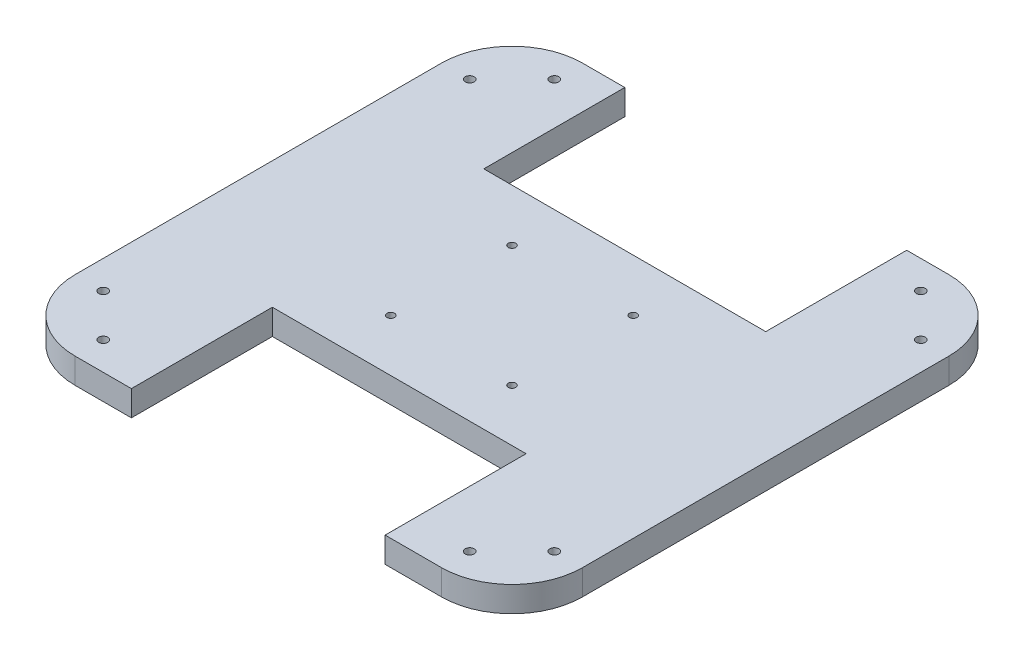
ISO-10303-21;
HEADER;
FILE_DESCRIPTION(('STEP AP214'),'2;1');
FILE_NAME('part.step','',(''),(''),'','','');
FILE_SCHEMA(('AUTOMOTIVE_DESIGN { 1 0 10303 214 1 1 1 1 }'));
ENDSEC;
DATA;
#1=APPLICATION_CONTEXT('core data for automotive mechanical design processes');
#2=APPLICATION_PROTOCOL_DEFINITION('international standard','automotive_design',2000,#1);
#3=PRODUCT_CONTEXT('',#1,'mechanical');
#4=PRODUCT('Part','Part','',(#3));
#5=PRODUCT_RELATED_PRODUCT_CATEGORY('part','',(#4));
#6=PRODUCT_DEFINITION_FORMATION('','',#4);
#7=PRODUCT_DEFINITION_CONTEXT('part definition',#1,'design');
#8=PRODUCT_DEFINITION('design','',#6,#7);
#9=PRODUCT_DEFINITION_SHAPE('','',#8);
#10=(LENGTH_UNIT() NAMED_UNIT(*) SI_UNIT(.MILLI.,.METRE.));
#11=(NAMED_UNIT(*) PLANE_ANGLE_UNIT() SI_UNIT($,.RADIAN.));
#12=(NAMED_UNIT(*) SI_UNIT($,.STERADIAN.) SOLID_ANGLE_UNIT());
#13=UNCERTAINTY_MEASURE_WITH_UNIT(LENGTH_MEASURE(1.E-05),#10,'distance_accuracy_value','');
#14=(GEOMETRIC_REPRESENTATION_CONTEXT(3) GLOBAL_UNCERTAINTY_ASSIGNED_CONTEXT((#13)) GLOBAL_UNIT_ASSIGNED_CONTEXT((#10,
#11,#12)) REPRESENTATION_CONTEXT('',''));
#15=CARTESIAN_POINT('',(0.,0.,0.));
#16=DIRECTION('',(0.,0.,1.));
#17=DIRECTION('',(1.,0.,0.));
#18=AXIS2_PLACEMENT_3D('',#15,#16,#17);
#19=CARTESIAN_POINT('',(-21.5,0.,-21.4999999999999));
#20=DIRECTION('',(0.,1.,0.));
#21=DIRECTION('',(0.,0.,1.));
#22=AXIS2_PLACEMENT_3D('',#19,#20,#21);
#23=CYLINDRICAL_SURFACE('',#22,1.325);
#24=CARTESIAN_POINT('',(-21.5,9.,-21.4999999999999));
#25=DIRECTION('',(0.,1.,0.));
#26=DIRECTION('',(0.,0.,1.));
#27=AXIS2_PLACEMENT_3D('',#24,#25,#26);
#28=CIRCLE('',#27,1.325);
#29=CARTESIAN_POINT('',(-21.5,9.,-20.1749999999999));
#30=VERTEX_POINT('',#29);
#31=EDGE_CURVE('E262',#30,#30,#28,.T.);
#32=ORIENTED_EDGE('',*,*,#31,.T.);
#33=EDGE_LOOP('',(#32));
#34=FACE_BOUND('',#33,.T.);
#35=CARTESIAN_POINT('',(-21.5,5.,-21.4999999999999));
#36=DIRECTION('',(0.,-1.,0.));
#37=DIRECTION('',(0.,0.,-1.));
#38=AXIS2_PLACEMENT_3D('',#35,#36,#37);
#39=CIRCLE('',#38,1.325);
#40=CARTESIAN_POINT('',(-21.5,5.,-22.8249999999999));
#41=VERTEX_POINT('',#40);
#42=EDGE_CURVE('E43',#41,#41,#39,.F.);
#43=ORIENTED_EDGE('',*,*,#42,.F.);
#44=EDGE_LOOP('',(#43));
#45=FACE_BOUND('',#44,.T.);
#46=ADVANCED_FACE('F39',(#34,#45),#23,.F.);
#47=CARTESIAN_POINT('',(21.5,0.,-21.4999999999999));
#48=DIRECTION('',(0.,1.,0.));
#49=DIRECTION('',(0.,0.,1.));
#50=AXIS2_PLACEMENT_3D('',#47,#48,#49);
#51=CYLINDRICAL_SURFACE('',#50,1.325);
#52=CARTESIAN_POINT('',(21.5,9.,-21.4999999999999));
#53=DIRECTION('',(0.,1.,0.));
#54=DIRECTION('',(0.,0.,1.));
#55=AXIS2_PLACEMENT_3D('',#52,#53,#54);
#56=CIRCLE('',#55,1.325);
#57=CARTESIAN_POINT('',(21.5,9.,-20.1749999999999));
#58=VERTEX_POINT('',#57);
#59=EDGE_CURVE('E259',#58,#58,#56,.T.);
#60=ORIENTED_EDGE('',*,*,#59,.T.);
#61=EDGE_LOOP('',(#60));
#62=FACE_BOUND('',#61,.T.);
#63=CARTESIAN_POINT('',(21.5,5.,-21.4999999999999));
#64=DIRECTION('',(0.,-1.,0.));
#65=DIRECTION('',(0.,0.,-1.));
#66=AXIS2_PLACEMENT_3D('',#63,#64,#65);
#67=CIRCLE('',#66,1.325);
#68=CARTESIAN_POINT('',(21.5,5.,-22.8249999999999));
#69=VERTEX_POINT('',#68);
#70=EDGE_CURVE('E225',#69,#69,#67,.F.);
#71=ORIENTED_EDGE('',*,*,#70,.F.);
#72=EDGE_LOOP('',(#71));
#73=FACE_BOUND('',#72,.T.);
#74=ADVANCED_FACE('F417',(#62,#73),#51,.F.);
#75=CARTESIAN_POINT('',(21.5,0.,21.5000000000001));
#76=DIRECTION('',(0.,1.,0.));
#77=DIRECTION('',(0.,0.,1.));
#78=AXIS2_PLACEMENT_3D('',#75,#76,#77);
#79=CYLINDRICAL_SURFACE('',#78,1.325);
#80=CARTESIAN_POINT('',(21.5,9.,21.5000000000001));
#81=DIRECTION('',(0.,1.,0.));
#82=DIRECTION('',(0.,0.,1.));
#83=AXIS2_PLACEMENT_3D('',#80,#81,#82);
#84=CIRCLE('',#83,1.325);
#85=CARTESIAN_POINT('',(21.5,9.,22.8250000000001));
#86=VERTEX_POINT('',#85);
#87=EDGE_CURVE('E263',#86,#86,#84,.T.);
#88=ORIENTED_EDGE('',*,*,#87,.T.);
#89=EDGE_LOOP('',(#88));
#90=FACE_BOUND('',#89,.T.);
#91=CARTESIAN_POINT('',(21.5,5.,21.5000000000001));
#92=DIRECTION('',(0.,-1.,0.));
#93=DIRECTION('',(0.,0.,-1.));
#94=AXIS2_PLACEMENT_3D('',#91,#92,#93);
#95=CIRCLE('',#94,1.325);
#96=CARTESIAN_POINT('',(21.5,5.,20.1750000000001));
#97=VERTEX_POINT('',#96);
#98=EDGE_CURVE('E222',#97,#97,#95,.F.);
#99=ORIENTED_EDGE('',*,*,#98,.F.);
#100=EDGE_LOOP('',(#99));
#101=FACE_BOUND('',#100,.T.);
#102=ADVANCED_FACE('F423',(#90,#101),#79,.F.);
#103=CARTESIAN_POINT('',(-21.5,0.,21.5000000000001));
#104=DIRECTION('',(0.,1.,0.));
#105=DIRECTION('',(0.,0.,1.));
#106=AXIS2_PLACEMENT_3D('',#103,#104,#105);
#107=CYLINDRICAL_SURFACE('',#106,1.325);
#108=CARTESIAN_POINT('',(-21.5,9.,21.5000000000001));
#109=DIRECTION('',(0.,1.,0.));
#110=DIRECTION('',(0.,0.,1.));
#111=AXIS2_PLACEMENT_3D('',#108,#109,#110);
#112=CIRCLE('',#111,1.325);
#113=CARTESIAN_POINT('',(-21.5,9.,22.8250000000001));
#114=VERTEX_POINT('',#113);
#115=EDGE_CURVE('E266',#114,#114,#112,.T.);
#116=ORIENTED_EDGE('',*,*,#115,.T.);
#117=EDGE_LOOP('',(#116));
#118=FACE_BOUND('',#117,.T.);
#119=CARTESIAN_POINT('',(-21.5,5.,21.5000000000001));
#120=DIRECTION('',(0.,-1.,0.));
#121=DIRECTION('',(0.,0.,-1.));
#122=AXIS2_PLACEMENT_3D('',#119,#120,#121);
#123=CIRCLE('',#122,1.325);
#124=CARTESIAN_POINT('',(-21.5,5.,20.1750000000001));
#125=VERTEX_POINT('',#124);
#126=EDGE_CURVE('E219',#125,#125,#123,.F.);
#127=ORIENTED_EDGE('',*,*,#126,.F.);
#128=EDGE_LOOP('',(#127));
#129=FACE_BOUND('',#128,.T.);
#130=ADVANCED_FACE('F429',(#118,#129),#107,.F.);
#131=CARTESIAN_POINT('',(-64.9999999999998,9.,-90.0000000000001));
#132=DIRECTION('',(0.,0.,1.));
#133=DIRECTION('',(1.,0.,0.));
#134=AXIS2_PLACEMENT_3D('',#131,#132,#133);
#135=PLANE('',#134);
#136=DIRECTION('',(-1.,0.,0.));
#137=VECTOR('',#136,1.);
#138=CARTESIAN_POINT('',(-64.9999999999998,0.,-90.0000000000001));
#139=LINE('',#138,#137);
#140=CARTESIAN_POINT('',(64.9999999999998,0.,-90.0000000000001));
#141=VERTEX_POINT('',#140);
#142=CARTESIAN_POINT('',(50.,0.,-90.0000000000001));
#143=VERTEX_POINT('',#142);
#144=EDGE_CURVE('E169',#141,#143,#139,.T.);
#145=ORIENTED_EDGE('',*,*,#144,.T.);
#146=DIRECTION('',(0.,1.,0.));
#147=VECTOR('',#146,1.);
#148=CARTESIAN_POINT('',(50.,0.,-90.0000000000001));
#149=LINE('',#148,#147);
#150=CARTESIAN_POINT('',(50.,9.,-90.0000000000001));
#151=VERTEX_POINT('',#150);
#152=EDGE_CURVE('E154',#143,#151,#149,.T.);
#153=ORIENTED_EDGE('',*,*,#152,.T.);
#154=DIRECTION('',(-1.,0.,0.));
#155=VECTOR('',#154,1.);
#156=CARTESIAN_POINT('',(-64.9999999999998,9.,-90.0000000000001));
#157=LINE('',#156,#155);
#158=CARTESIAN_POINT('',(64.9999999999998,9.,-90.0000000000001));
#159=VERTEX_POINT('',#158);
#160=EDGE_CURVE('E323',#159,#151,#157,.T.);
#161=ORIENTED_EDGE('',*,*,#160,.F.);
#162=DIRECTION('',(0.,-1.,0.));
#163=VECTOR('',#162,1.);
#164=CARTESIAN_POINT('',(64.9999999999998,9.,-90.0000000000001));
#165=LINE('',#164,#163);
#166=EDGE_CURVE('E11',#159,#141,#165,.T.);
#167=ORIENTED_EDGE('',*,*,#166,.T.);
#168=EDGE_LOOP('',(#145,#153,#161,#167));
#169=FACE_BOUND('',#168,.T.);
#170=ADVANCED_FACE('F174',(#169),#135,.F.);
#171=CARTESIAN_POINT('',(-64.9999999999998,9.,90.0000000000001));
#172=DIRECTION('',(0.,0.,-1.));
#173=DIRECTION('',(-1.,0.,0.));
#174=AXIS2_PLACEMENT_3D('',#171,#172,#173);
#175=PLANE('',#174);
#176=DIRECTION('',(1.,0.,0.));
#177=VECTOR('',#176,1.);
#178=CARTESIAN_POINT('',(-64.9999999999998,9.,90.0000000000001));
#179=LINE('',#178,#177);
#180=CARTESIAN_POINT('',(45.,9.,90.0000000000001));
#181=VERTEX_POINT('',#180);
#182=CARTESIAN_POINT('',(64.9999999999998,9.,90.0000000000001));
#183=VERTEX_POINT('',#182);
#184=EDGE_CURVE('E331',#181,#183,#179,.T.);
#185=ORIENTED_EDGE('',*,*,#184,.F.);
#186=DIRECTION('',(0.,1.,0.));
#187=VECTOR('',#186,1.);
#188=CARTESIAN_POINT('',(45.,0.,90.0000000000001));
#189=LINE('',#188,#187);
#190=CARTESIAN_POINT('',(45.,0.,90.0000000000001));
#191=VERTEX_POINT('',#190);
#192=EDGE_CURVE('E230',#191,#181,#189,.T.);
#193=ORIENTED_EDGE('',*,*,#192,.F.);
#194=DIRECTION('',(1.,0.,0.));
#195=VECTOR('',#194,1.);
#196=CARTESIAN_POINT('',(-64.9999999999998,0.,90.0000000000001));
#197=LINE('',#196,#195);
#198=CARTESIAN_POINT('',(64.9999999999998,0.,90.0000000000001));
#199=VERTEX_POINT('',#198);
#200=EDGE_CURVE('E189',#191,#199,#197,.T.);
#201=ORIENTED_EDGE('',*,*,#200,.T.);
#202=DIRECTION('',(0.,-1.,0.));
#203=VECTOR('',#202,1.);
#204=CARTESIAN_POINT('',(64.9999999999998,9.,90.0000000000001));
#205=LINE('',#204,#203);
#206=EDGE_CURVE('E205',#183,#199,#205,.T.);
#207=ORIENTED_EDGE('',*,*,#206,.F.);
#208=EDGE_LOOP('',(#185,#193,#201,#207));
#209=FACE_BOUND('',#208,.T.);
#210=ADVANCED_FACE('F354',(#209),#175,.F.);
#211=CARTESIAN_POINT('',(64.9999999999998,9.,-64.9999999999999));
#212=DIRECTION('',(0.,-1.,0.));
#213=DIRECTION('',(0.,0.,-1.));
#214=AXIS2_PLACEMENT_3D('',#211,#212,#213);
#215=CYLINDRICAL_SURFACE('',#214,25.0000000000002);
#216=CARTESIAN_POINT('',(64.9999999999998,0.,-64.9999999999999));
#217=DIRECTION('',(0.,1.,0.));
#218=DIRECTION('',(0.,0.,-1.));
#219=AXIS2_PLACEMENT_3D('',#216,#217,#218);
#220=CIRCLE('',#219,25.0000000000002);
#221=CARTESIAN_POINT('',(90.,0.,-64.9999999999999));
#222=VERTEX_POINT('',#221);
#223=EDGE_CURVE('E182',#222,#141,#220,.T.);
#224=ORIENTED_EDGE('',*,*,#223,.T.);
#225=ORIENTED_EDGE('',*,*,#166,.F.);
#226=CARTESIAN_POINT('',(64.9999999999998,9.,-64.9999999999999));
#227=DIRECTION('',(0.,1.,0.));
#228=DIRECTION('',(0.,0.,-1.));
#229=AXIS2_PLACEMENT_3D('',#226,#227,#228);
#230=CIRCLE('',#229,25.0000000000002);
#231=CARTESIAN_POINT('',(90.,9.,-64.9999999999999));
#232=VERTEX_POINT('',#231);
#233=EDGE_CURVE('E197',#232,#159,#230,.T.);
#234=ORIENTED_EDGE('',*,*,#233,.F.);
#235=DIRECTION('',(0.,-1.,0.));
#236=VECTOR('',#235,1.);
#237=CARTESIAN_POINT('',(90.,9.,-64.9999999999999));
#238=LINE('',#237,#236);
#239=EDGE_CURVE('E198',#232,#222,#238,.T.);
#240=ORIENTED_EDGE('',*,*,#239,.T.);
#241=EDGE_LOOP('',(#224,#225,#234,#240));
#242=FACE_BOUND('',#241,.T.);
#243=ADVANCED_FACE('F41',(#242),#215,.T.);
#244=CARTESIAN_POINT('',(-50.,9.,-90.0000000000001));
#245=VERTEX_POINT('',#244);
#246=CARTESIAN_POINT('',(-64.9999999999998,9.,-90.0000000000001));
#247=VERTEX_POINT('',#246);
#248=EDGE_CURVE('E322',#245,#247,#157,.T.);
#249=ORIENTED_EDGE('',*,*,#248,.F.);
#250=DIRECTION('',(0.,1.,0.));
#251=VECTOR('',#250,1.);
#252=CARTESIAN_POINT('',(-50.,0.,-90.0000000000001));
#253=LINE('',#252,#251);
#254=CARTESIAN_POINT('',(-50.,0.,-90.0000000000001));
#255=VERTEX_POINT('',#254);
#256=EDGE_CURVE('E163',#255,#245,#253,.T.);
#257=ORIENTED_EDGE('',*,*,#256,.F.);
#258=CARTESIAN_POINT('',(-64.9999999999998,0.,-90.0000000000001));
#259=VERTEX_POINT('',#258);
#260=EDGE_CURVE('E178',#255,#259,#139,.T.);
#261=ORIENTED_EDGE('',*,*,#260,.T.);
#262=DIRECTION('',(0.,-1.,0.));
#263=VECTOR('',#262,1.);
#264=CARTESIAN_POINT('',(-64.9999999999998,9.,-90.0000000000001));
#265=LINE('',#264,#263);
#266=EDGE_CURVE('E48',#247,#259,#265,.T.);
#267=ORIENTED_EDGE('',*,*,#266,.F.);
#268=EDGE_LOOP('',(#249,#257,#261,#267));
#269=FACE_BOUND('',#268,.T.);
#270=ADVANCED_FACE('F385',(#269),#135,.F.);
#271=CARTESIAN_POINT('',(-64.9999999999998,9.,-64.9999999999999));
#272=DIRECTION('',(0.,-1.,0.));
#273=DIRECTION('',(0.,0.,-1.));
#274=AXIS2_PLACEMENT_3D('',#271,#272,#273);
#275=CYLINDRICAL_SURFACE('',#274,25.0000000000002);
#276=CARTESIAN_POINT('',(-64.9999999999998,0.,-64.9999999999999));
#277=DIRECTION('',(0.,1.,0.));
#278=DIRECTION('',(0.,0.,-1.));
#279=AXIS2_PLACEMENT_3D('',#276,#277,#278);
#280=CIRCLE('',#279,25.0000000000002);
#281=CARTESIAN_POINT('',(-90.,0.,-64.9999999999999));
#282=VERTEX_POINT('',#281);
#283=EDGE_CURVE('E177',#259,#282,#280,.T.);
#284=ORIENTED_EDGE('',*,*,#283,.T.);
#285=DIRECTION('',(0.,-1.,0.));
#286=VECTOR('',#285,1.);
#287=CARTESIAN_POINT('',(-90.,9.,-64.9999999999999));
#288=LINE('',#287,#286);
#289=CARTESIAN_POINT('',(-90.,9.,-64.9999999999999));
#290=VERTEX_POINT('',#289);
#291=EDGE_CURVE('E214',#290,#282,#288,.T.);
#292=ORIENTED_EDGE('',*,*,#291,.F.);
#293=CARTESIAN_POINT('',(-64.9999999999998,9.,-64.9999999999999));
#294=DIRECTION('',(0.,1.,0.));
#295=DIRECTION('',(0.,0.,-1.));
#296=AXIS2_PLACEMENT_3D('',#293,#294,#295);
#297=CIRCLE('',#296,25.0000000000002);
#298=EDGE_CURVE('E325',#247,#290,#297,.T.);
#299=ORIENTED_EDGE('',*,*,#298,.F.);
#300=ORIENTED_EDGE('',*,*,#266,.T.);
#301=EDGE_LOOP('',(#284,#292,#299,#300));
#302=FACE_BOUND('',#301,.T.);
#303=ADVANCED_FACE('F381',(#302),#275,.T.);
#304=CARTESIAN_POINT('',(-90.,9.,65.));
#305=DIRECTION('',(1.,0.,0.));
#306=DIRECTION('',(0.,0.,-1.));
#307=AXIS2_PLACEMENT_3D('',#304,#305,#306);
#308=PLANE('',#307);
#309=DIRECTION('',(0.,0.,1.));
#310=VECTOR('',#309,1.);
#311=CARTESIAN_POINT('',(-90.,0.,65.));
#312=LINE('',#311,#310);
#313=CARTESIAN_POINT('',(-90.,0.,65.));
#314=VERTEX_POINT('',#313);
#315=EDGE_CURVE('E180',#282,#314,#312,.T.);
#316=ORIENTED_EDGE('',*,*,#315,.T.);
#317=DIRECTION('',(0.,-1.,0.));
#318=VECTOR('',#317,1.);
#319=CARTESIAN_POINT('',(-90.,9.,65.));
#320=LINE('',#319,#318);
#321=CARTESIAN_POINT('',(-90.,9.,65.));
#322=VERTEX_POINT('',#321);
#323=EDGE_CURVE('E211',#322,#314,#320,.T.);
#324=ORIENTED_EDGE('',*,*,#323,.F.);
#325=DIRECTION('',(0.,0.,1.));
#326=VECTOR('',#325,1.);
#327=CARTESIAN_POINT('',(-90.,9.,65.));
#328=LINE('',#327,#326);
#329=EDGE_CURVE('E327',#290,#322,#328,.T.);
#330=ORIENTED_EDGE('',*,*,#329,.F.);
#331=ORIENTED_EDGE('',*,*,#291,.T.);
#332=EDGE_LOOP('',(#316,#324,#330,#331));
#333=FACE_BOUND('',#332,.T.);
#334=ADVANCED_FACE('F376',(#333),#308,.F.);
#335=CARTESIAN_POINT('',(-65.,9.,65.));
#336=DIRECTION('',(0.,-1.,0.));
#337=DIRECTION('',(0.,0.,-1.));
#338=AXIS2_PLACEMENT_3D('',#335,#336,#337);
#339=CYLINDRICAL_SURFACE('',#338,25.);
#340=CARTESIAN_POINT('',(-65.,0.,65.));
#341=DIRECTION('',(0.,1.,0.));
#342=DIRECTION('',(0.,0.,-1.));
#343=AXIS2_PLACEMENT_3D('',#340,#341,#342);
#344=CIRCLE('',#343,25.);
#345=CARTESIAN_POINT('',(-64.9999999999998,0.,90.0000000000001));
#346=VERTEX_POINT('',#345);
#347=EDGE_CURVE('E187',#314,#346,#344,.T.);
#348=ORIENTED_EDGE('',*,*,#347,.T.);
#349=DIRECTION('',(0.,-1.,0.));
#350=VECTOR('',#349,1.);
#351=CARTESIAN_POINT('',(-64.9999999999998,9.,90.0000000000001));
#352=LINE('',#351,#350);
#353=CARTESIAN_POINT('',(-64.9999999999998,9.,90.0000000000001));
#354=VERTEX_POINT('',#353);
#355=EDGE_CURVE('E208',#354,#346,#352,.T.);
#356=ORIENTED_EDGE('',*,*,#355,.F.);
#357=CARTESIAN_POINT('',(-65.,9.,65.));
#358=DIRECTION('',(0.,1.,0.));
#359=DIRECTION('',(0.,0.,-1.));
#360=AXIS2_PLACEMENT_3D('',#357,#358,#359);
#361=CIRCLE('',#360,25.);
#362=EDGE_CURVE('E329',#322,#354,#361,.T.);
#363=ORIENTED_EDGE('',*,*,#362,.F.);
#364=ORIENTED_EDGE('',*,*,#323,.T.);
#365=EDGE_LOOP('',(#348,#356,#363,#364));
#366=FACE_BOUND('',#365,.T.);
#367=ADVANCED_FACE('F370',(#366),#339,.T.);
#368=CARTESIAN_POINT('',(-45.,0.,90.0000000000001));
#369=VERTEX_POINT('',#368);
#370=EDGE_CURVE('E190',#346,#369,#197,.T.);
#371=ORIENTED_EDGE('',*,*,#370,.T.);
#372=DIRECTION('',(0.,1.,0.));
#373=VECTOR('',#372,1.);
#374=CARTESIAN_POINT('',(-45.,0.,90.0000000000001));
#375=LINE('',#374,#373);
#376=CARTESIAN_POINT('',(-45.,9.,90.0000000000001));
#377=VERTEX_POINT('',#376);
#378=EDGE_CURVE('E233',#369,#377,#375,.T.);
#379=ORIENTED_EDGE('',*,*,#378,.T.);
#380=EDGE_CURVE('E332',#354,#377,#179,.T.);
#381=ORIENTED_EDGE('',*,*,#380,.F.);
#382=ORIENTED_EDGE('',*,*,#355,.T.);
#383=EDGE_LOOP('',(#371,#379,#381,#382));
#384=FACE_BOUND('',#383,.T.);
#385=ADVANCED_FACE('F365',(#384),#175,.F.);
#386=CARTESIAN_POINT('',(65.,9.,65.));
#387=DIRECTION('',(0.,-1.,0.));
#388=DIRECTION('',(0.,0.,-1.));
#389=AXIS2_PLACEMENT_3D('',#386,#387,#388);
#390=CYLINDRICAL_SURFACE('',#389,25.);
#391=CARTESIAN_POINT('',(65.,0.,65.));
#392=DIRECTION('',(0.,1.,0.));
#393=DIRECTION('',(0.,0.,-1.));
#394=AXIS2_PLACEMENT_3D('',#391,#392,#393);
#395=CIRCLE('',#394,25.);
#396=CARTESIAN_POINT('',(90.,0.,65.));
#397=VERTEX_POINT('',#396);
#398=EDGE_CURVE('E193',#199,#397,#395,.T.);
#399=ORIENTED_EDGE('',*,*,#398,.T.);
#400=DIRECTION('',(0.,-1.,0.));
#401=VECTOR('',#400,1.);
#402=CARTESIAN_POINT('',(90.,9.,65.));
#403=LINE('',#402,#401);
#404=CARTESIAN_POINT('',(90.,9.,65.));
#405=VERTEX_POINT('',#404);
#406=EDGE_CURVE('E201',#405,#397,#403,.T.);
#407=ORIENTED_EDGE('',*,*,#406,.F.);
#408=CARTESIAN_POINT('',(65.,9.,65.));
#409=DIRECTION('',(0.,1.,0.));
#410=DIRECTION('',(0.,0.,-1.));
#411=AXIS2_PLACEMENT_3D('',#408,#409,#410);
#412=CIRCLE('',#411,25.);
#413=EDGE_CURVE('E335',#183,#405,#412,.T.);
#414=ORIENTED_EDGE('',*,*,#413,.F.);
#415=ORIENTED_EDGE('',*,*,#206,.T.);
#416=EDGE_LOOP('',(#399,#407,#414,#415));
#417=FACE_BOUND('',#416,.T.);
#418=ADVANCED_FACE('F350',(#417),#390,.T.);
#419=CARTESIAN_POINT('',(90.,9.,65.));
#420=DIRECTION('',(-1.,0.,0.));
#421=DIRECTION('',(0.,0.,1.));
#422=AXIS2_PLACEMENT_3D('',#419,#420,#421);
#423=PLANE('',#422);
#424=DIRECTION('',(0.,0.,-1.));
#425=VECTOR('',#424,1.);
#426=CARTESIAN_POINT('',(90.,0.,65.));
#427=LINE('',#426,#425);
#428=EDGE_CURVE('E195',#397,#222,#427,.T.);
#429=ORIENTED_EDGE('',*,*,#428,.T.);
#430=ORIENTED_EDGE('',*,*,#239,.F.);
#431=DIRECTION('',(0.,0.,-1.));
#432=VECTOR('',#431,1.);
#433=CARTESIAN_POINT('',(90.,9.,65.));
#434=LINE('',#433,#432);
#435=EDGE_CURVE('E202',#405,#232,#434,.T.);
#436=ORIENTED_EDGE('',*,*,#435,.F.);
#437=ORIENTED_EDGE('',*,*,#406,.T.);
#438=EDGE_LOOP('',(#429,#430,#436,#437));
#439=FACE_BOUND('',#438,.T.);
#440=ADVANCED_FACE('F344',(#439),#423,.F.);
#441=CARTESIAN_POINT('',(64.9999999999998,9.,-64.9999999999999));
#442=DIRECTION('',(0.,-1.,0.));
#443=DIRECTION('',(0.,0.,-1.));
#444=AXIS2_PLACEMENT_3D('',#441,#442,#443);
#445=PLANE('',#444);
#446=ORIENTED_EDGE('',*,*,#115,.F.);
#447=EDGE_LOOP('',(#446));
#448=FACE_BOUND('',#447,.T.);
#449=ORIENTED_EDGE('',*,*,#87,.F.);
#450=EDGE_LOOP('',(#449));
#451=FACE_BOUND('',#450,.T.);
#452=ORIENTED_EDGE('',*,*,#59,.F.);
#453=EDGE_LOOP('',(#452));
#454=FACE_BOUND('',#453,.T.);
#455=ORIENTED_EDGE('',*,*,#31,.F.);
#456=EDGE_LOOP('',(#455));
#457=FACE_BOUND('',#456,.T.);
#458=CARTESIAN_POINT('',(64.9999999999998,9.,-79.9999999999999));
#459=DIRECTION('',(0.,1.,0.));
#460=DIRECTION('',(0.,0.,1.));
#461=AXIS2_PLACEMENT_3D('',#458,#459,#460);
#462=CIRCLE('',#461,1.60000000000001);
#463=CARTESIAN_POINT('',(64.9999999999998,9.,-78.3999999999999));
#464=VERTEX_POINT('',#463);
#465=EDGE_CURVE('E298',#464,#464,#462,.T.);
#466=ORIENTED_EDGE('',*,*,#465,.F.);
#467=EDGE_LOOP('',(#466));
#468=FACE_BOUND('',#467,.T.);
#469=CARTESIAN_POINT('',(79.9999999999998,9.,65.));
#470=DIRECTION('',(0.,1.,0.));
#471=DIRECTION('',(0.,0.,1.));
#472=AXIS2_PLACEMENT_3D('',#469,#470,#471);
#473=CIRCLE('',#472,1.60000000000001);
#474=CARTESIAN_POINT('',(79.9999999999998,9.,66.6));
#475=VERTEX_POINT('',#474);
#476=EDGE_CURVE('E291',#475,#475,#473,.T.);
#477=ORIENTED_EDGE('',*,*,#476,.F.);
#478=EDGE_LOOP('',(#477));
#479=FACE_BOUND('',#478,.T.);
#480=CARTESIAN_POINT('',(79.9999999999998,9.,-64.9999999999999));
#481=DIRECTION('',(0.,1.,0.));
#482=DIRECTION('',(0.,0.,1.));
#483=AXIS2_PLACEMENT_3D('',#480,#481,#482);
#484=CIRCLE('',#483,1.60000000000001);
#485=CARTESIAN_POINT('',(79.9999999999998,9.,-63.3999999999999));
#486=VERTEX_POINT('',#485);
#487=EDGE_CURVE('E310',#486,#486,#484,.T.);
#488=ORIENTED_EDGE('',*,*,#487,.F.);
#489=EDGE_LOOP('',(#488));
#490=FACE_BOUND('',#489,.T.);
#491=CARTESIAN_POINT('',(-79.9999999999998,9.,-64.9999999999999));
#492=DIRECTION('',(0.,1.,0.));
#493=DIRECTION('',(0.,0.,1.));
#494=AXIS2_PLACEMENT_3D('',#491,#492,#493);
#495=CIRCLE('',#494,1.60000000000001);
#496=CARTESIAN_POINT('',(-79.9999999999998,9.,-63.3999999999999));
#497=VERTEX_POINT('',#496);
#498=EDGE_CURVE('E303',#497,#497,#495,.T.);
#499=ORIENTED_EDGE('',*,*,#498,.F.);
#500=EDGE_LOOP('',(#499));
#501=FACE_BOUND('',#500,.T.);
#502=CARTESIAN_POINT('',(64.9999999999998,9.,80.));
#503=DIRECTION('',(0.,1.,0.));
#504=DIRECTION('',(0.,0.,1.));
#505=AXIS2_PLACEMENT_3D('',#502,#503,#504);
#506=CIRCLE('',#505,1.60000000000001);
#507=CARTESIAN_POINT('',(64.9999999999998,9.,81.6));
#508=VERTEX_POINT('',#507);
#509=EDGE_CURVE('E273',#508,#508,#506,.T.);
#510=ORIENTED_EDGE('',*,*,#509,.F.);
#511=EDGE_LOOP('',(#510));
#512=FACE_BOUND('',#511,.T.);
#513=CARTESIAN_POINT('',(-64.9999999999997,9.,80.));
#514=DIRECTION('',(0.,1.,0.));
#515=DIRECTION('',(0.,0.,1.));
#516=AXIS2_PLACEMENT_3D('',#513,#514,#515);
#517=CIRCLE('',#516,1.60000000000001);
#518=CARTESIAN_POINT('',(-64.9999999999997,9.,81.6));
#519=VERTEX_POINT('',#518);
#520=EDGE_CURVE('E280',#519,#519,#517,.T.);
#521=ORIENTED_EDGE('',*,*,#520,.F.);
#522=EDGE_LOOP('',(#521));
#523=FACE_BOUND('',#522,.T.);
#524=CARTESIAN_POINT('',(-79.9999999999997,9.,65.));
#525=DIRECTION('',(0.,1.,0.));
#526=DIRECTION('',(0.,0.,1.));
#527=AXIS2_PLACEMENT_3D('',#524,#525,#526);
#528=CIRCLE('',#527,1.60000000000001);
#529=CARTESIAN_POINT('',(-79.9999999999997,9.,66.6));
#530=VERTEX_POINT('',#529);
#531=EDGE_CURVE('E286',#530,#530,#528,.T.);
#532=ORIENTED_EDGE('',*,*,#531,.F.);
#533=EDGE_LOOP('',(#532));
#534=FACE_BOUND('',#533,.T.);
#535=CARTESIAN_POINT('',(-64.9999999999998,9.,-79.9999999999999));
#536=DIRECTION('',(0.,1.,0.));
#537=DIRECTION('',(0.,0.,1.));
#538=AXIS2_PLACEMENT_3D('',#535,#536,#537);
#539=CIRCLE('',#538,1.60000000000001);
#540=CARTESIAN_POINT('',(-64.9999999999998,9.,-78.3999999999999));
#541=VERTEX_POINT('',#540);
#542=EDGE_CURVE('E306',#541,#541,#539,.T.);
#543=ORIENTED_EDGE('',*,*,#542,.F.);
#544=EDGE_LOOP('',(#543));
#545=FACE_BOUND('',#544,.T.);
#546=ORIENTED_EDGE('',*,*,#160,.T.);
#547=DIRECTION('',(0.,0.,-1.));
#548=VECTOR('',#547,1.);
#549=CARTESIAN_POINT('',(50.,9.,-90.0000000000001));
#550=LINE('',#549,#548);
#551=CARTESIAN_POINT('',(50.,9.,-40.0000000000001));
#552=VERTEX_POINT('',#551);
#553=EDGE_CURVE('E159',#552,#151,#550,.T.);
#554=ORIENTED_EDGE('',*,*,#553,.F.);
#555=DIRECTION('',(1.,0.,0.));
#556=VECTOR('',#555,1.);
#557=CARTESIAN_POINT('',(50.,9.,-40.0000000000001));
#558=LINE('',#557,#556);
#559=CARTESIAN_POINT('',(-50.,9.,-40.0000000000001));
#560=VERTEX_POINT('',#559);
#561=EDGE_CURVE('E172',#560,#552,#558,.T.);
#562=ORIENTED_EDGE('',*,*,#561,.F.);
#563=DIRECTION('',(0.,0.,1.));
#564=VECTOR('',#563,1.);
#565=CARTESIAN_POINT('',(-50.,9.,-90.0000000000001));
#566=LINE('',#565,#564);
#567=EDGE_CURVE('E393',#245,#560,#566,.T.);
#568=ORIENTED_EDGE('',*,*,#567,.F.);
#569=ORIENTED_EDGE('',*,*,#248,.T.);
#570=ORIENTED_EDGE('',*,*,#298,.T.);
#571=ORIENTED_EDGE('',*,*,#329,.T.);
#572=ORIENTED_EDGE('',*,*,#362,.T.);
#573=ORIENTED_EDGE('',*,*,#380,.T.);
#574=DIRECTION('',(0.,0.,1.));
#575=VECTOR('',#574,1.);
#576=CARTESIAN_POINT('',(-45.,9.,90.0000000000001));
#577=LINE('',#576,#575);
#578=CARTESIAN_POINT('',(-45.,9.,40.0000000000001));
#579=VERTEX_POINT('',#578);
#580=EDGE_CURVE('E244',#579,#377,#577,.T.);
#581=ORIENTED_EDGE('',*,*,#580,.F.);
#582=DIRECTION('',(-1.,0.,0.));
#583=VECTOR('',#582,1.);
#584=CARTESIAN_POINT('',(45.,9.,40.));
#585=LINE('',#584,#583);
#586=CARTESIAN_POINT('',(45.,9.,40.));
#587=VERTEX_POINT('',#586);
#588=EDGE_CURVE('E246',#587,#579,#585,.T.);
#589=ORIENTED_EDGE('',*,*,#588,.F.);
#590=DIRECTION('',(0.,0.,-1.));
#591=VECTOR('',#590,1.);
#592=CARTESIAN_POINT('',(45.,9.,90.0000000000001));
#593=LINE('',#592,#591);
#594=EDGE_CURVE('E250',#181,#587,#593,.T.);
#595=ORIENTED_EDGE('',*,*,#594,.F.);
#596=ORIENTED_EDGE('',*,*,#184,.T.);
#597=ORIENTED_EDGE('',*,*,#413,.T.);
#598=ORIENTED_EDGE('',*,*,#435,.T.);
#599=ORIENTED_EDGE('',*,*,#233,.T.);
#600=EDGE_LOOP('',(#546,#554,#562,#568,#569,#570,#571,#572,#573,#581,#589,#595,#596,#597,#598,#599));
#601=FACE_BOUND('',#600,.T.);
#602=ADVANCED_FACE('F339',(#448,#451,#454,#457,#468,#479,#490,#501,#512,#523,#534,#545,#601),
#445,.F.);
#603=CARTESIAN_POINT('',(64.9999999999998,0.,-64.9999999999999));
#604=DIRECTION('',(0.,-1.,0.));
#605=DIRECTION('',(0.,0.,-1.));
#606=AXIS2_PLACEMENT_3D('',#603,#604,#605);
#607=PLANE('',#606);
#608=CARTESIAN_POINT('',(21.5,0.,21.5000000000001));
#609=DIRECTION('',(0.,-1.,0.));
#610=DIRECTION('',(0.,0.,-1.));
#611=AXIS2_PLACEMENT_3D('',#608,#609,#610);
#612=CIRCLE('',#611,3.5);
#613=CARTESIAN_POINT('',(21.5,0.,18.0000000000001));
#614=VERTEX_POINT('',#613);
#615=EDGE_CURVE('E548',#614,#614,#612,.T.);
#616=ORIENTED_EDGE('',*,*,#615,.F.);
#617=EDGE_LOOP('',(#616));
#618=FACE_BOUND('',#617,.T.);
#619=CARTESIAN_POINT('',(-21.5,0.,-21.4999999999999));
#620=DIRECTION('',(0.,-1.,0.));
#621=DIRECTION('',(0.,0.,-1.));
#622=AXIS2_PLACEMENT_3D('',#619,#620,#621);
#623=CIRCLE('',#622,3.5);
#624=CARTESIAN_POINT('',(-21.5,0.,-24.9999999999999));
#625=VERTEX_POINT('',#624);
#626=EDGE_CURVE('E544',#625,#625,#623,.T.);
#627=ORIENTED_EDGE('',*,*,#626,.F.);
#628=EDGE_LOOP('',(#627));
#629=FACE_BOUND('',#628,.T.);
#630=CARTESIAN_POINT('',(21.5,0.,-21.4999999999999));
#631=DIRECTION('',(0.,-1.,0.));
#632=DIRECTION('',(0.,0.,-1.));
#633=AXIS2_PLACEMENT_3D('',#630,#631,#632);
#634=CIRCLE('',#633,3.5);
#635=CARTESIAN_POINT('',(21.5,0.,-24.9999999999999));
#636=VERTEX_POINT('',#635);
#637=EDGE_CURVE('E539',#636,#636,#634,.T.);
#638=ORIENTED_EDGE('',*,*,#637,.F.);
#639=EDGE_LOOP('',(#638));
#640=FACE_BOUND('',#639,.T.);
#641=CARTESIAN_POINT('',(-21.5,0.,21.5000000000001));
#642=DIRECTION('',(0.,-1.,0.));
#643=DIRECTION('',(0.,0.,-1.));
#644=AXIS2_PLACEMENT_3D('',#641,#642,#643);
#645=CIRCLE('',#644,3.5);
#646=CARTESIAN_POINT('',(-21.5,0.,18.0000000000001));
#647=VERTEX_POINT('',#646);
#648=EDGE_CURVE('E551',#647,#647,#645,.T.);
#649=ORIENTED_EDGE('',*,*,#648,.F.);
#650=EDGE_LOOP('',(#649));
#651=FACE_BOUND('',#650,.T.);
#652=DIRECTION('',(0.,0.,-1.));
#653=VECTOR('',#652,1.);
#654=CARTESIAN_POINT('',(50.,0.,-90.0000000000001));
#655=LINE('',#654,#653);
#656=CARTESIAN_POINT('',(50.,0.,-40.0000000000001));
#657=VERTEX_POINT('',#656);
#658=EDGE_CURVE('E157',#657,#143,#655,.T.);
#659=ORIENTED_EDGE('',*,*,#658,.T.);
#660=ORIENTED_EDGE('',*,*,#144,.F.);
#661=ORIENTED_EDGE('',*,*,#223,.F.);
#662=ORIENTED_EDGE('',*,*,#428,.F.);
#663=ORIENTED_EDGE('',*,*,#398,.F.);
#664=ORIENTED_EDGE('',*,*,#200,.F.);
#665=DIRECTION('',(0.,0.,-1.));
#666=VECTOR('',#665,1.);
#667=CARTESIAN_POINT('',(45.,0.,90.0000000000001));
#668=LINE('',#667,#666);
#669=CARTESIAN_POINT('',(45.,0.,40.));
#670=VERTEX_POINT('',#669);
#671=EDGE_CURVE('E247',#191,#670,#668,.T.);
#672=ORIENTED_EDGE('',*,*,#671,.T.);
#673=DIRECTION('',(-1.,0.,0.));
#674=VECTOR('',#673,1.);
#675=CARTESIAN_POINT('',(45.,0.,40.));
#676=LINE('',#675,#674);
#677=CARTESIAN_POINT('',(-45.,0.,40.0000000000001));
#678=VERTEX_POINT('',#677);
#679=EDGE_CURVE('E253',#670,#678,#676,.T.);
#680=ORIENTED_EDGE('',*,*,#679,.T.);
#681=DIRECTION('',(0.,0.,1.));
#682=VECTOR('',#681,1.);
#683=CARTESIAN_POINT('',(-45.,0.,90.0000000000001));
#684=LINE('',#683,#682);
#685=EDGE_CURVE('E64',#678,#369,#684,.T.);
#686=ORIENTED_EDGE('',*,*,#685,.T.);
#687=ORIENTED_EDGE('',*,*,#370,.F.);
#688=ORIENTED_EDGE('',*,*,#347,.F.);
#689=ORIENTED_EDGE('',*,*,#315,.F.);
#690=ORIENTED_EDGE('',*,*,#283,.F.);
#691=ORIENTED_EDGE('',*,*,#260,.F.);
#692=DIRECTION('',(0.,0.,1.));
#693=VECTOR('',#692,1.);
#694=CARTESIAN_POINT('',(-50.,0.,-90.0000000000001));
#695=LINE('',#694,#693);
#696=CARTESIAN_POINT('',(-50.,0.,-40.0000000000001));
#697=VERTEX_POINT('',#696);
#698=EDGE_CURVE('E171',#255,#697,#695,.T.);
#699=ORIENTED_EDGE('',*,*,#698,.T.);
#700=DIRECTION('',(1.,0.,0.));
#701=VECTOR('',#700,1.);
#702=CARTESIAN_POINT('',(50.,0.,-40.0000000000001));
#703=LINE('',#702,#701);
#704=EDGE_CURVE('E56',#697,#657,#703,.T.);
#705=ORIENTED_EDGE('',*,*,#704,.T.);
#706=EDGE_LOOP('',(#659,#660,#661,#662,#663,#664,#672,#680,#686,#687,#688,#689,#690,#691,#699,#705));
#707=FACE_BOUND('',#706,.T.);
#708=CARTESIAN_POINT('',(64.9999999999998,0.,-79.9999999999999));
#709=DIRECTION('',(0.,1.,0.));
#710=DIRECTION('',(0.,0.,1.));
#711=AXIS2_PLACEMENT_3D('',#708,#709,#710);
#712=CIRCLE('',#711,1.60000000000001);
#713=CARTESIAN_POINT('',(64.9999999999998,0.,-78.3999999999999));
#714=VERTEX_POINT('',#713);
#715=EDGE_CURVE('E276',#714,#714,#712,.T.);
#716=ORIENTED_EDGE('',*,*,#715,.T.);
#717=EDGE_LOOP('',(#716));
#718=FACE_BOUND('',#717,.T.);
#719=CARTESIAN_POINT('',(79.9999999999998,0.,65.));
#720=DIRECTION('',(0.,1.,0.));
#721=DIRECTION('',(0.,0.,1.));
#722=AXIS2_PLACEMENT_3D('',#719,#720,#721);
#723=CIRCLE('',#722,1.60000000000001);
#724=CARTESIAN_POINT('',(79.9999999999998,0.,66.6));
#725=VERTEX_POINT('',#724);
#726=EDGE_CURVE('E295',#725,#725,#723,.T.);
#727=ORIENTED_EDGE('',*,*,#726,.T.);
#728=EDGE_LOOP('',(#727));
#729=FACE_BOUND('',#728,.T.);
#730=CARTESIAN_POINT('',(79.9999999999998,0.,-64.9999999999999));
#731=DIRECTION('',(0.,1.,0.));
#732=DIRECTION('',(0.,0.,1.));
#733=AXIS2_PLACEMENT_3D('',#730,#731,#732);
#734=CIRCLE('',#733,1.60000000000001);
#735=CARTESIAN_POINT('',(79.9999999999998,0.,-63.3999999999999));
#736=VERTEX_POINT('',#735);
#737=EDGE_CURVE('E294',#736,#736,#734,.T.);
#738=ORIENTED_EDGE('',*,*,#737,.T.);
#739=EDGE_LOOP('',(#738));
#740=FACE_BOUND('',#739,.T.);
#741=CARTESIAN_POINT('',(-79.9999999999998,0.,-64.9999999999999));
#742=DIRECTION('',(0.,1.,0.));
#743=DIRECTION('',(0.,0.,1.));
#744=AXIS2_PLACEMENT_3D('',#741,#742,#743);
#745=CIRCLE('',#744,1.60000000000001);
#746=CARTESIAN_POINT('',(-79.9999999999998,0.,-63.3999999999999));
#747=VERTEX_POINT('',#746);
#748=EDGE_CURVE('E307',#747,#747,#745,.T.);
#749=ORIENTED_EDGE('',*,*,#748,.T.);
#750=EDGE_LOOP('',(#749));
#751=FACE_BOUND('',#750,.T.);
#752=CARTESIAN_POINT('',(64.9999999999998,0.,80.));
#753=DIRECTION('',(0.,1.,0.));
#754=DIRECTION('',(0.,0.,1.));
#755=AXIS2_PLACEMENT_3D('',#752,#753,#754);
#756=CIRCLE('',#755,1.60000000000001);
#757=CARTESIAN_POINT('',(64.9999999999998,0.,81.6));
#758=VERTEX_POINT('',#757);
#759=EDGE_CURVE('E277',#758,#758,#756,.T.);
#760=ORIENTED_EDGE('',*,*,#759,.T.);
#761=EDGE_LOOP('',(#760));
#762=FACE_BOUND('',#761,.T.);
#763=CARTESIAN_POINT('',(-64.9999999999997,0.,80.));
#764=DIRECTION('',(0.,1.,0.));
#765=DIRECTION('',(0.,0.,1.));
#766=AXIS2_PLACEMENT_3D('',#763,#764,#765);
#767=CIRCLE('',#766,1.60000000000001);
#768=CARTESIAN_POINT('',(-64.9999999999997,0.,81.6));
#769=VERTEX_POINT('',#768);
#770=EDGE_CURVE('E283',#769,#769,#767,.T.);
#771=ORIENTED_EDGE('',*,*,#770,.T.);
#772=EDGE_LOOP('',(#771));
#773=FACE_BOUND('',#772,.T.);
#774=CARTESIAN_POINT('',(-79.9999999999997,0.,65.));
#775=DIRECTION('',(0.,1.,0.));
#776=DIRECTION('',(0.,0.,1.));
#777=AXIS2_PLACEMENT_3D('',#774,#775,#776);
#778=CIRCLE('',#777,1.60000000000001);
#779=CARTESIAN_POINT('',(-79.9999999999997,0.,66.6));
#780=VERTEX_POINT('',#779);
#781=EDGE_CURVE('E272',#780,#780,#778,.T.);
#782=ORIENTED_EDGE('',*,*,#781,.T.);
#783=EDGE_LOOP('',(#782));
#784=FACE_BOUND('',#783,.T.);
#785=CARTESIAN_POINT('',(-64.9999999999998,0.,-79.9999999999999));
#786=DIRECTION('',(0.,1.,0.));
#787=DIRECTION('',(0.,0.,1.));
#788=AXIS2_PLACEMENT_3D('',#785,#786,#787);
#789=CIRCLE('',#788,1.60000000000001);
#790=CARTESIAN_POINT('',(-64.9999999999998,0.,-78.3999999999999));
#791=VERTEX_POINT('',#790);
#792=EDGE_CURVE('E315',#791,#791,#789,.T.);
#793=ORIENTED_EDGE('',*,*,#792,.T.);
#794=EDGE_LOOP('',(#793));
#795=FACE_BOUND('',#794,.T.);
#796=ADVANCED_FACE('F166',(#618,#629,#640,#651,#707,#718,#729,#740,#751,#762,#773,#784,#795),
#607,.T.);
#797=CARTESIAN_POINT('',(-64.9999999999998,0.,-79.9999999999999));
#798=DIRECTION('',(0.,1.,0.));
#799=DIRECTION('',(0.,0.,1.));
#800=AXIS2_PLACEMENT_3D('',#797,#798,#799);
#801=CYLINDRICAL_SURFACE('',#800,1.60000000000001);
#802=ORIENTED_EDGE('',*,*,#792,.F.);
#803=EDGE_LOOP('',(#802));
#804=FACE_BOUND('',#803,.T.);
#805=ORIENTED_EDGE('',*,*,#542,.T.);
#806=EDGE_LOOP('',(#805));
#807=FACE_BOUND('',#806,.T.);
#808=ADVANCED_FACE('F443',(#804,#807),#801,.F.);
#809=CARTESIAN_POINT('',(-79.9999999999997,0.,65.));
#810=DIRECTION('',(0.,1.,0.));
#811=DIRECTION('',(0.,0.,1.));
#812=AXIS2_PLACEMENT_3D('',#809,#810,#811);
#813=CYLINDRICAL_SURFACE('',#812,1.60000000000001);
#814=ORIENTED_EDGE('',*,*,#781,.F.);
#815=EDGE_LOOP('',(#814));
#816=FACE_BOUND('',#815,.T.);
#817=ORIENTED_EDGE('',*,*,#531,.T.);
#818=EDGE_LOOP('',(#817));
#819=FACE_BOUND('',#818,.T.);
#820=ADVANCED_FACE('F439',(#816,#819),#813,.F.);
#821=CARTESIAN_POINT('',(-64.9999999999997,0.,80.));
#822=DIRECTION('',(0.,1.,0.));
#823=DIRECTION('',(0.,0.,1.));
#824=AXIS2_PLACEMENT_3D('',#821,#822,#823);
#825=CYLINDRICAL_SURFACE('',#824,1.60000000000001);
#826=ORIENTED_EDGE('',*,*,#770,.F.);
#827=EDGE_LOOP('',(#826));
#828=FACE_BOUND('',#827,.T.);
#829=ORIENTED_EDGE('',*,*,#520,.T.);
#830=EDGE_LOOP('',(#829));
#831=FACE_BOUND('',#830,.T.);
#832=ADVANCED_FACE('F435',(#828,#831),#825,.F.);
#833=CARTESIAN_POINT('',(64.9999999999998,0.,80.));
#834=DIRECTION('',(0.,1.,0.));
#835=DIRECTION('',(0.,0.,1.));
#836=AXIS2_PLACEMENT_3D('',#833,#834,#835);
#837=CYLINDRICAL_SURFACE('',#836,1.60000000000001);
#838=ORIENTED_EDGE('',*,*,#759,.F.);
#839=EDGE_LOOP('',(#838));
#840=FACE_BOUND('',#839,.T.);
#841=ORIENTED_EDGE('',*,*,#509,.T.);
#842=EDGE_LOOP('',(#841));
#843=FACE_BOUND('',#842,.T.);
#844=ADVANCED_FACE('F431',(#840,#843),#837,.F.);
#845=CARTESIAN_POINT('',(-79.9999999999998,0.,-64.9999999999999));
#846=DIRECTION('',(0.,1.,0.));
#847=DIRECTION('',(0.,0.,1.));
#848=AXIS2_PLACEMENT_3D('',#845,#846,#847);
#849=CYLINDRICAL_SURFACE('',#848,1.60000000000001);
#850=ORIENTED_EDGE('',*,*,#748,.F.);
#851=EDGE_LOOP('',(#850));
#852=FACE_BOUND('',#851,.T.);
#853=ORIENTED_EDGE('',*,*,#498,.T.);
#854=EDGE_LOOP('',(#853));
#855=FACE_BOUND('',#854,.T.);
#856=ADVANCED_FACE('F434',(#852,#855),#849,.F.);
#857=CARTESIAN_POINT('',(79.9999999999998,0.,-64.9999999999999));
#858=DIRECTION('',(0.,1.,0.));
#859=DIRECTION('',(0.,0.,1.));
#860=AXIS2_PLACEMENT_3D('',#857,#858,#859);
#861=CYLINDRICAL_SURFACE('',#860,1.60000000000001);
#862=ORIENTED_EDGE('',*,*,#737,.F.);
#863=EDGE_LOOP('',(#862));
#864=FACE_BOUND('',#863,.T.);
#865=ORIENTED_EDGE('',*,*,#487,.T.);
#866=EDGE_LOOP('',(#865));
#867=FACE_BOUND('',#866,.T.);
#868=ADVANCED_FACE('F449',(#864,#867),#861,.F.);
#869=CARTESIAN_POINT('',(79.9999999999998,0.,65.));
#870=DIRECTION('',(0.,1.,0.));
#871=DIRECTION('',(0.,0.,1.));
#872=AXIS2_PLACEMENT_3D('',#869,#870,#871);
#873=CYLINDRICAL_SURFACE('',#872,1.60000000000001);
#874=ORIENTED_EDGE('',*,*,#726,.F.);
#875=EDGE_LOOP('',(#874));
#876=FACE_BOUND('',#875,.T.);
#877=ORIENTED_EDGE('',*,*,#476,.T.);
#878=EDGE_LOOP('',(#877));
#879=FACE_BOUND('',#878,.T.);
#880=ADVANCED_FACE('F445',(#876,#879),#873,.F.);
#881=CARTESIAN_POINT('',(64.9999999999998,0.,-79.9999999999999));
#882=DIRECTION('',(0.,1.,0.));
#883=DIRECTION('',(0.,0.,1.));
#884=AXIS2_PLACEMENT_3D('',#881,#882,#883);
#885=CYLINDRICAL_SURFACE('',#884,1.60000000000001);
#886=ORIENTED_EDGE('',*,*,#715,.F.);
#887=EDGE_LOOP('',(#886));
#888=FACE_BOUND('',#887,.T.);
#889=ORIENTED_EDGE('',*,*,#465,.T.);
#890=EDGE_LOOP('',(#889));
#891=FACE_BOUND('',#890,.T.);
#892=ADVANCED_FACE('F448',(#888,#891),#885,.F.);
#893=CARTESIAN_POINT('',(45.,0.,90.0000000000001));
#894=DIRECTION('',(1.,0.,0.));
#895=DIRECTION('',(0.,0.,-1.));
#896=AXIS2_PLACEMENT_3D('',#893,#894,#895);
#897=PLANE('',#896);
#898=ORIENTED_EDGE('',*,*,#594,.T.);
#899=DIRECTION('',(0.,1.,0.));
#900=VECTOR('',#899,1.);
#901=CARTESIAN_POINT('',(45.,0.,40.));
#902=LINE('',#901,#900);
#903=EDGE_CURVE('E254',#670,#587,#902,.T.);
#904=ORIENTED_EDGE('',*,*,#903,.F.);
#905=ORIENTED_EDGE('',*,*,#671,.F.);
#906=ORIENTED_EDGE('',*,*,#192,.T.);
#907=EDGE_LOOP('',(#898,#904,#905,#906));
#908=FACE_BOUND('',#907,.T.);
#909=ADVANCED_FACE('F357',(#908),#897,.F.);
#910=CARTESIAN_POINT('',(-45.,0.,90.0000000000001));
#911=DIRECTION('',(-1.,0.,0.));
#912=DIRECTION('',(0.,0.,1.));
#913=AXIS2_PLACEMENT_3D('',#910,#911,#912);
#914=PLANE('',#913);
#915=ORIENTED_EDGE('',*,*,#580,.T.);
#916=ORIENTED_EDGE('',*,*,#378,.F.);
#917=ORIENTED_EDGE('',*,*,#685,.F.);
#918=DIRECTION('',(0.,1.,0.));
#919=VECTOR('',#918,1.);
#920=CARTESIAN_POINT('',(-45.,0.,40.0000000000001));
#921=LINE('',#920,#919);
#922=EDGE_CURVE('E240',#678,#579,#921,.T.);
#923=ORIENTED_EDGE('',*,*,#922,.T.);
#924=EDGE_LOOP('',(#915,#916,#917,#923));
#925=FACE_BOUND('',#924,.T.);
#926=ADVANCED_FACE('F401',(#925),#914,.F.);
#927=CARTESIAN_POINT('',(45.,0.,40.));
#928=DIRECTION('',(0.,0.,-1.));
#929=DIRECTION('',(-1.,0.,0.));
#930=AXIS2_PLACEMENT_3D('',#927,#928,#929);
#931=PLANE('',#930);
#932=ORIENTED_EDGE('',*,*,#588,.T.);
#933=ORIENTED_EDGE('',*,*,#922,.F.);
#934=ORIENTED_EDGE('',*,*,#679,.F.);
#935=ORIENTED_EDGE('',*,*,#903,.T.);
#936=EDGE_LOOP('',(#932,#933,#934,#935));
#937=FACE_BOUND('',#936,.T.);
#938=ADVANCED_FACE('F361',(#937),#931,.F.);
#939=CARTESIAN_POINT('',(50.,0.,-90.0000000000001));
#940=DIRECTION('',(1.,0.,0.));
#941=DIRECTION('',(0.,0.,-1.));
#942=AXIS2_PLACEMENT_3D('',#939,#940,#941);
#943=PLANE('',#942);
#944=ORIENTED_EDGE('',*,*,#553,.T.);
#945=ORIENTED_EDGE('',*,*,#152,.F.);
#946=ORIENTED_EDGE('',*,*,#658,.F.);
#947=DIRECTION('',(0.,1.,0.));
#948=VECTOR('',#947,1.);
#949=CARTESIAN_POINT('',(50.,0.,-40.0000000000001));
#950=LINE('',#949,#948);
#951=EDGE_CURVE('E269',#657,#552,#950,.T.);
#952=ORIENTED_EDGE('',*,*,#951,.T.);
#953=EDGE_LOOP('',(#944,#945,#946,#952));
#954=FACE_BOUND('',#953,.T.);
#955=ADVANCED_FACE('F156',(#954),#943,.F.);
#956=CARTESIAN_POINT('',(50.,0.,-40.0000000000001));
#957=DIRECTION('',(0.,0.,1.));
#958=DIRECTION('',(1.,0.,0.));
#959=AXIS2_PLACEMENT_3D('',#956,#957,#958);
#960=PLANE('',#959);
#961=ORIENTED_EDGE('',*,*,#561,.T.);
#962=ORIENTED_EDGE('',*,*,#951,.F.);
#963=ORIENTED_EDGE('',*,*,#704,.F.);
#964=DIRECTION('',(0.,1.,0.));
#965=VECTOR('',#964,1.);
#966=CARTESIAN_POINT('',(-50.,0.,-40.0000000000001));
#967=LINE('',#966,#965);
#968=EDGE_CURVE('E399',#697,#560,#967,.T.);
#969=ORIENTED_EDGE('',*,*,#968,.T.);
#970=EDGE_LOOP('',(#961,#962,#963,#969));
#971=FACE_BOUND('',#970,.T.);
#972=ADVANCED_FACE('F405',(#971),#960,.F.);
#973=CARTESIAN_POINT('',(-50.,0.,-90.0000000000001));
#974=DIRECTION('',(-1.,0.,0.));
#975=DIRECTION('',(0.,0.,1.));
#976=AXIS2_PLACEMENT_3D('',#973,#974,#975);
#977=PLANE('',#976);
#978=ORIENTED_EDGE('',*,*,#567,.T.);
#979=ORIENTED_EDGE('',*,*,#968,.F.);
#980=ORIENTED_EDGE('',*,*,#698,.F.);
#981=ORIENTED_EDGE('',*,*,#256,.T.);
#982=EDGE_LOOP('',(#978,#979,#980,#981));
#983=FACE_BOUND('',#982,.T.);
#984=ADVANCED_FACE('F404',(#983),#977,.F.);
#985=CARTESIAN_POINT('',(-21.5,5.,21.5000000000001));
#986=DIRECTION('',(0.,-1.,0.));
#987=DIRECTION('',(0.,0.,-1.));
#988=AXIS2_PLACEMENT_3D('',#985,#986,#987);
#989=PLANE('',#988);
#990=CARTESIAN_POINT('',(-21.5,5.,21.5000000000001));
#991=DIRECTION('',(0.,-1.,0.));
#992=DIRECTION('',(0.,0.,-1.));
#993=AXIS2_PLACEMENT_3D('',#990,#991,#992);
#994=CIRCLE('',#993,3.5);
#995=CARTESIAN_POINT('',(-21.5,5.,18.0000000000001));
#996=VERTEX_POINT('',#995);
#997=EDGE_CURVE('E223',#996,#996,#994,.T.);
#998=ORIENTED_EDGE('',*,*,#997,.T.);
#999=EDGE_LOOP('',(#998));
#1000=FACE_BOUND('',#999,.T.);
#1001=ORIENTED_EDGE('',*,*,#126,.T.);
#1002=EDGE_LOOP('',(#1001));
#1003=FACE_BOUND('',#1002,.T.);
#1004=ADVANCED_FACE('F412',(#1000,#1003),#989,.T.);
#1005=CARTESIAN_POINT('',(-21.5,5.,21.5000000000001));
#1006=DIRECTION('',(0.,-1.,0.));
#1007=DIRECTION('',(0.,0.,-1.));
#1008=AXIS2_PLACEMENT_3D('',#1005,#1006,#1007);
#1009=CYLINDRICAL_SURFACE('',#1008,3.5);
#1010=ORIENTED_EDGE('',*,*,#997,.F.);
#1011=EDGE_LOOP('',(#1010));
#1012=FACE_BOUND('',#1011,.T.);
#1013=ORIENTED_EDGE('',*,*,#648,.T.);
#1014=EDGE_LOOP('',(#1013));
#1015=FACE_BOUND('',#1014,.T.);
#1016=ADVANCED_FACE('F499',(#1012,#1015),#1009,.F.);
#1017=CARTESIAN_POINT('',(21.5,5.,21.5000000000001));
#1018=DIRECTION('',(0.,-1.,0.));
#1019=DIRECTION('',(0.,0.,-1.));
#1020=AXIS2_PLACEMENT_3D('',#1017,#1018,#1019);
#1021=PLANE('',#1020);
#1022=CARTESIAN_POINT('',(21.5,5.,21.5000000000001));
#1023=DIRECTION('',(0.,-1.,0.));
#1024=DIRECTION('',(0.,0.,-1.));
#1025=AXIS2_PLACEMENT_3D('',#1022,#1023,#1024);
#1026=CIRCLE('',#1025,3.5);
#1027=CARTESIAN_POINT('',(21.5,5.,18.0000000000001));
#1028=VERTEX_POINT('',#1027);
#1029=EDGE_CURVE('E552',#1028,#1028,#1026,.T.);
#1030=ORIENTED_EDGE('',*,*,#1029,.T.);
#1031=EDGE_LOOP('',(#1030));
#1032=FACE_BOUND('',#1031,.T.);
#1033=ORIENTED_EDGE('',*,*,#98,.T.);
#1034=EDGE_LOOP('',(#1033));
#1035=FACE_BOUND('',#1034,.T.);
#1036=ADVANCED_FACE('F505',(#1032,#1035),#1021,.T.);
#1037=CARTESIAN_POINT('',(21.5,5.,21.5000000000001));
#1038=DIRECTION('',(0.,-1.,0.));
#1039=DIRECTION('',(0.,0.,-1.));
#1040=AXIS2_PLACEMENT_3D('',#1037,#1038,#1039);
#1041=CYLINDRICAL_SURFACE('',#1040,3.5);
#1042=ORIENTED_EDGE('',*,*,#1029,.F.);
#1043=EDGE_LOOP('',(#1042));
#1044=FACE_BOUND('',#1043,.T.);
#1045=ORIENTED_EDGE('',*,*,#615,.T.);
#1046=EDGE_LOOP('',(#1045));
#1047=FACE_BOUND('',#1046,.T.);
#1048=ADVANCED_FACE('F520',(#1044,#1047),#1041,.F.);
#1049=CARTESIAN_POINT('',(21.5,5.,-21.4999999999999));
#1050=DIRECTION('',(0.,-1.,0.));
#1051=DIRECTION('',(0.,0.,-1.));
#1052=AXIS2_PLACEMENT_3D('',#1049,#1050,#1051);
#1053=PLANE('',#1052);
#1054=CARTESIAN_POINT('',(21.5,5.,-21.4999999999999));
#1055=DIRECTION('',(0.,-1.,0.));
#1056=DIRECTION('',(0.,0.,-1.));
#1057=AXIS2_PLACEMENT_3D('',#1054,#1055,#1056);
#1058=CIRCLE('',#1057,3.5);
#1059=CARTESIAN_POINT('',(21.5,5.,-24.9999999999999));
#1060=VERTEX_POINT('',#1059);
#1061=EDGE_CURVE('E536',#1060,#1060,#1058,.T.);
#1062=ORIENTED_EDGE('',*,*,#1061,.T.);
#1063=EDGE_LOOP('',(#1062));
#1064=FACE_BOUND('',#1063,.T.);
#1065=ORIENTED_EDGE('',*,*,#70,.T.);
#1066=EDGE_LOOP('',(#1065));
#1067=FACE_BOUND('',#1066,.T.);
#1068=ADVANCED_FACE('F524',(#1064,#1067),#1053,.T.);
#1069=CARTESIAN_POINT('',(21.5,5.,-21.4999999999999));
#1070=DIRECTION('',(0.,-1.,0.));
#1071=DIRECTION('',(0.,0.,-1.));
#1072=AXIS2_PLACEMENT_3D('',#1069,#1070,#1071);
#1073=CYLINDRICAL_SURFACE('',#1072,3.5);
#1074=ORIENTED_EDGE('',*,*,#1061,.F.);
#1075=EDGE_LOOP('',(#1074));
#1076=FACE_BOUND('',#1075,.T.);
#1077=ORIENTED_EDGE('',*,*,#637,.T.);
#1078=EDGE_LOOP('',(#1077));
#1079=FACE_BOUND('',#1078,.T.);
#1080=ADVANCED_FACE('F513',(#1076,#1079),#1073,.F.);
#1081=CARTESIAN_POINT('',(-21.5,5.,-21.4999999999999));
#1082=DIRECTION('',(0.,-1.,0.));
#1083=DIRECTION('',(0.,0.,-1.));
#1084=AXIS2_PLACEMENT_3D('',#1081,#1082,#1083);
#1085=PLANE('',#1084);
#1086=CARTESIAN_POINT('',(-21.5,5.,-21.4999999999999));
#1087=DIRECTION('',(0.,-1.,0.));
#1088=DIRECTION('',(0.,0.,-1.));
#1089=AXIS2_PLACEMENT_3D('',#1086,#1087,#1088);
#1090=CIRCLE('',#1089,3.5);
#1091=CARTESIAN_POINT('',(-21.5,5.,-24.9999999999999));
#1092=VERTEX_POINT('',#1091);
#1093=EDGE_CURVE('E541',#1092,#1092,#1090,.T.);
#1094=ORIENTED_EDGE('',*,*,#1093,.T.);
#1095=EDGE_LOOP('',(#1094));
#1096=FACE_BOUND('',#1095,.T.);
#1097=ORIENTED_EDGE('',*,*,#42,.T.);
#1098=EDGE_LOOP('',(#1097));
#1099=FACE_BOUND('',#1098,.T.);
#1100=ADVANCED_FACE('F509',(#1096,#1099),#1085,.T.);
#1101=CARTESIAN_POINT('',(-21.5,5.,-21.4999999999999));
#1102=DIRECTION('',(0.,-1.,0.));
#1103=DIRECTION('',(0.,0.,-1.));
#1104=AXIS2_PLACEMENT_3D('',#1101,#1102,#1103);
#1105=CYLINDRICAL_SURFACE('',#1104,3.5);
#1106=ORIENTED_EDGE('',*,*,#1093,.F.);
#1107=EDGE_LOOP('',(#1106));
#1108=FACE_BOUND('',#1107,.T.);
#1109=ORIENTED_EDGE('',*,*,#626,.T.);
#1110=EDGE_LOOP('',(#1109));
#1111=FACE_BOUND('',#1110,.T.);
#1112=ADVANCED_FACE('F512',(#1108,#1111),#1105,.F.);
#1113=CLOSED_SHELL('',(#46,#74,#102,#130,#170,#210,#243,#270,#303,#334,#367,#385,#418,#440,#602,
#796,#808,#820,#832,#844,#856,#868,#880,#892,#909,#926,#938,#955,#972,#984,#1004,#1016,#1036,
#1048,#1068,#1080,#1100,#1112));
#1114=MANIFOLD_SOLID_BREP('B2',#1113);
#1115=ADVANCED_BREP_SHAPE_REPRESENTATION('',(#18,#1114),#14);
#1116=SHAPE_DEFINITION_REPRESENTATION(#9,#1115);
ENDSEC;
END-ISO-10303-21;
